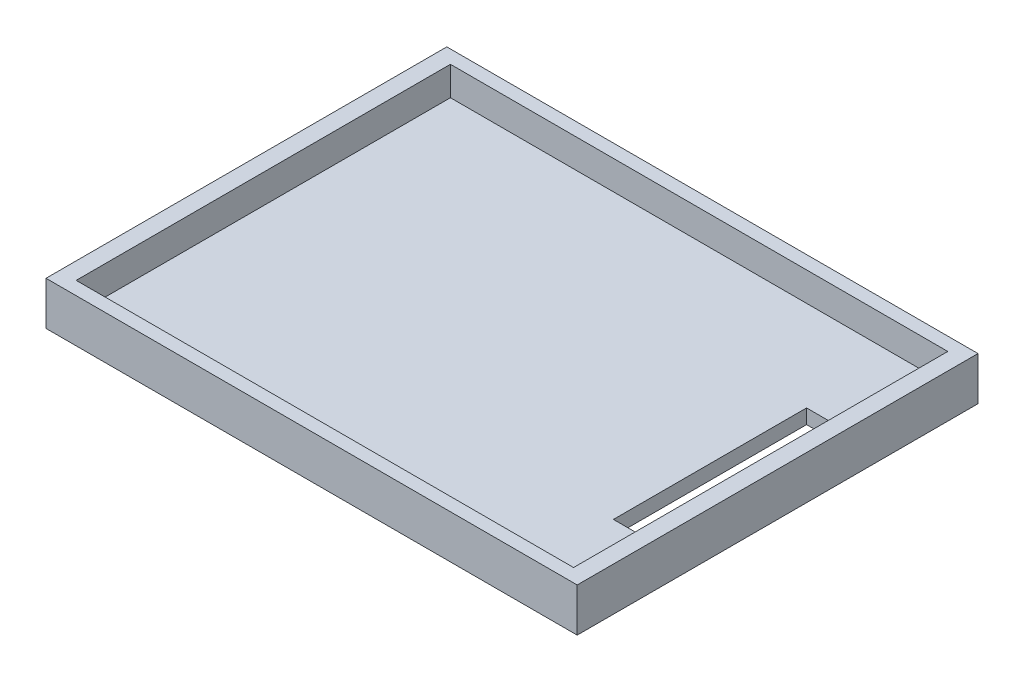
ISO-10303-21;
HEADER;
FILE_DESCRIPTION(('STEP AP214'),'2;1');
FILE_NAME('part.step','',(''),(''),'','','');
FILE_SCHEMA(('AUTOMOTIVE_DESIGN { 1 0 10303 214 1 1 1 1 }'));
ENDSEC;
DATA;
#1=APPLICATION_CONTEXT('core data for automotive mechanical design processes');
#2=APPLICATION_PROTOCOL_DEFINITION('international standard','automotive_design',2000,#1);
#3=PRODUCT_CONTEXT('',#1,'mechanical');
#4=PRODUCT('Part','Part','',(#3));
#5=PRODUCT_RELATED_PRODUCT_CATEGORY('part','',(#4));
#6=PRODUCT_DEFINITION_FORMATION('','',#4);
#7=PRODUCT_DEFINITION_CONTEXT('part definition',#1,'design');
#8=PRODUCT_DEFINITION('design','',#6,#7);
#9=PRODUCT_DEFINITION_SHAPE('','',#8);
#10=(LENGTH_UNIT() NAMED_UNIT(*) SI_UNIT(.MILLI.,.METRE.));
#11=(NAMED_UNIT(*) PLANE_ANGLE_UNIT() SI_UNIT($,.RADIAN.));
#12=(NAMED_UNIT(*) SI_UNIT($,.STERADIAN.) SOLID_ANGLE_UNIT());
#13=UNCERTAINTY_MEASURE_WITH_UNIT(LENGTH_MEASURE(1.E-05),#10,'distance_accuracy_value','');
#14=(GEOMETRIC_REPRESENTATION_CONTEXT(3) GLOBAL_UNCERTAINTY_ASSIGNED_CONTEXT((#13)) GLOBAL_UNIT_ASSIGNED_CONTEXT((#10,
#11,#12)) REPRESENTATION_CONTEXT('',''));
#15=CARTESIAN_POINT('',(0.,0.,0.));
#16=DIRECTION('',(0.,0.,1.));
#17=DIRECTION('',(1.,0.,0.));
#18=AXIS2_PLACEMENT_3D('',#15,#16,#17);
#19=CARTESIAN_POINT('',(51.,8.99999999999999,20.));
#20=DIRECTION('',(-1.,0.,0.));
#21=DIRECTION('',(0.,0.,1.));
#22=AXIS2_PLACEMENT_3D('',#19,#20,#21);
#23=PLANE('',#22);
#24=DIRECTION('',(0.,-1.,0.));
#25=VECTOR('',#24,1.);
#26=CARTESIAN_POINT('',(51.,8.99999999999999,20.));
#27=LINE('',#26,#25);
#28=CARTESIAN_POINT('',(51.,2.99999999999999,20.));
#29=VERTEX_POINT('',#28);
#30=CARTESIAN_POINT('',(51.,0.,20.));
#31=VERTEX_POINT('',#30);
#32=EDGE_CURVE('E190',#29,#31,#27,.T.);
#33=ORIENTED_EDGE('',*,*,#32,.F.);
#34=DIRECTION('',(0.,0.,-1.));
#35=VECTOR('',#34,1.);
#36=CARTESIAN_POINT('',(51.,2.99999999999999,20.));
#37=LINE('',#36,#35);
#38=CARTESIAN_POINT('',(51.,2.99999999999999,-20.));
#39=VERTEX_POINT('',#38);
#40=EDGE_CURVE('E68',#29,#39,#37,.T.);
#41=ORIENTED_EDGE('',*,*,#40,.T.);
#42=DIRECTION('',(0.,-1.,0.));
#43=VECTOR('',#42,1.);
#44=CARTESIAN_POINT('',(51.,8.99999999999999,-20.));
#45=LINE('',#44,#43);
#46=CARTESIAN_POINT('',(51.,0.,-20.));
#47=VERTEX_POINT('',#46);
#48=EDGE_CURVE('E196',#39,#47,#45,.T.);
#49=ORIENTED_EDGE('',*,*,#48,.T.);
#50=DIRECTION('',(0.,0.,-1.));
#51=VECTOR('',#50,1.);
#52=CARTESIAN_POINT('',(51.,0.,20.));
#53=LINE('',#52,#51);
#54=EDGE_CURVE('E178',#31,#47,#53,.T.);
#55=ORIENTED_EDGE('',*,*,#54,.F.);
#56=EDGE_LOOP('',(#33,#41,#49,#55));
#57=FACE_BOUND('',#56,.T.);
#58=ADVANCED_FACE('F45',(#57),#23,.T.);
#59=CARTESIAN_POINT('',(51.,8.99999999999999,-20.));
#60=DIRECTION('',(0.,0.,1.));
#61=DIRECTION('',(1.,0.,0.));
#62=AXIS2_PLACEMENT_3D('',#59,#60,#61);
#63=PLANE('',#62);
#64=ORIENTED_EDGE('',*,*,#48,.F.);
#65=DIRECTION('',(-1.,0.,0.));
#66=VECTOR('',#65,1.);
#67=CARTESIAN_POINT('',(51.,2.99999999999999,-20.));
#68=LINE('',#67,#66);
#69=CARTESIAN_POINT('',(41.,2.99999999999999,-20.));
#70=VERTEX_POINT('',#69);
#71=EDGE_CURVE('E174',#39,#70,#68,.T.);
#72=ORIENTED_EDGE('',*,*,#71,.T.);
#73=DIRECTION('',(0.,-1.,0.));
#74=VECTOR('',#73,1.);
#75=CARTESIAN_POINT('',(41.,8.99999999999999,-20.));
#76=LINE('',#75,#74);
#77=CARTESIAN_POINT('',(41.,0.,-20.));
#78=VERTEX_POINT('',#77);
#79=EDGE_CURVE('E194',#70,#78,#76,.T.);
#80=ORIENTED_EDGE('',*,*,#79,.T.);
#81=DIRECTION('',(-1.,0.,0.));
#82=VECTOR('',#81,1.);
#83=CARTESIAN_POINT('',(51.,0.,-20.));
#84=LINE('',#83,#82);
#85=EDGE_CURVE('E181',#47,#78,#84,.T.);
#86=ORIENTED_EDGE('',*,*,#85,.F.);
#87=EDGE_LOOP('',(#64,#72,#80,#86));
#88=FACE_BOUND('',#87,.T.);
#89=ADVANCED_FACE('F261',(#88),#63,.T.);
#90=CARTESIAN_POINT('',(41.,8.99999999999999,-20.));
#91=DIRECTION('',(1.,0.,0.));
#92=DIRECTION('',(0.,0.,-1.));
#93=AXIS2_PLACEMENT_3D('',#90,#91,#92);
#94=PLANE('',#93);
#95=ORIENTED_EDGE('',*,*,#79,.F.);
#96=DIRECTION('',(0.,0.,1.));
#97=VECTOR('',#96,1.);
#98=CARTESIAN_POINT('',(41.,2.99999999999999,-20.));
#99=LINE('',#98,#97);
#100=CARTESIAN_POINT('',(41.,2.99999999999999,20.));
#101=VERTEX_POINT('',#100);
#102=EDGE_CURVE('E168',#70,#101,#99,.T.);
#103=ORIENTED_EDGE('',*,*,#102,.T.);
#104=DIRECTION('',(0.,-1.,0.));
#105=VECTOR('',#104,1.);
#106=CARTESIAN_POINT('',(41.,8.99999999999999,20.));
#107=LINE('',#106,#105);
#108=CARTESIAN_POINT('',(41.,0.,20.));
#109=VERTEX_POINT('',#108);
#110=EDGE_CURVE('E192',#101,#109,#107,.T.);
#111=ORIENTED_EDGE('',*,*,#110,.T.);
#112=DIRECTION('',(0.,0.,1.));
#113=VECTOR('',#112,1.);
#114=CARTESIAN_POINT('',(41.,0.,-20.));
#115=LINE('',#114,#113);
#116=EDGE_CURVE('E184',#78,#109,#115,.T.);
#117=ORIENTED_EDGE('',*,*,#116,.F.);
#118=EDGE_LOOP('',(#95,#103,#111,#117));
#119=FACE_BOUND('',#118,.T.);
#120=ADVANCED_FACE('F256',(#119),#94,.T.);
#121=CARTESIAN_POINT('',(41.,8.99999999999999,20.));
#122=DIRECTION('',(0.,0.,-1.));
#123=DIRECTION('',(-1.,0.,0.));
#124=AXIS2_PLACEMENT_3D('',#121,#122,#123);
#125=PLANE('',#124);
#126=ORIENTED_EDGE('',*,*,#110,.F.);
#127=DIRECTION('',(1.,0.,0.));
#128=VECTOR('',#127,1.);
#129=CARTESIAN_POINT('',(41.,2.99999999999999,20.));
#130=LINE('',#129,#128);
#131=EDGE_CURVE('E11',#101,#29,#130,.T.);
#132=ORIENTED_EDGE('',*,*,#131,.T.);
#133=ORIENTED_EDGE('',*,*,#32,.T.);
#134=DIRECTION('',(1.,0.,0.));
#135=VECTOR('',#134,1.);
#136=CARTESIAN_POINT('',(41.,0.,20.));
#137=LINE('',#136,#135);
#138=EDGE_CURVE('E187',#109,#31,#137,.T.);
#139=ORIENTED_EDGE('',*,*,#138,.F.);
#140=EDGE_LOOP('',(#126,#132,#133,#139));
#141=FACE_BOUND('',#140,.T.);
#142=ADVANCED_FACE('F248',(#141),#125,.T.);
#143=CARTESIAN_POINT('',(0.,8.99999999999999,0.));
#144=DIRECTION('',(0.,1.,0.));
#145=DIRECTION('',(0.,0.,1.));
#146=AXIS2_PLACEMENT_3D('',#143,#144,#145);
#147=PLANE('',#146);
#148=DIRECTION('',(0.,0.,-1.));
#149=VECTOR('',#148,1.);
#150=CARTESIAN_POINT('',(51.5,8.99999999999999,-38.75));
#151=LINE('',#150,#149);
#152=CARTESIAN_POINT('',(51.5,8.99999999999999,38.75));
#153=VERTEX_POINT('',#152);
#154=CARTESIAN_POINT('',(51.5,8.99999999999999,-38.75));
#155=VERTEX_POINT('',#154);
#156=EDGE_CURVE('E60',#153,#155,#151,.T.);
#157=ORIENTED_EDGE('',*,*,#156,.F.);
#158=DIRECTION('',(1.,0.,0.));
#159=VECTOR('',#158,1.);
#160=CARTESIAN_POINT('',(-51.5,8.99999999999999,38.75));
#161=LINE('',#160,#159);
#162=CARTESIAN_POINT('',(-51.5,8.99999999999999,38.75));
#163=VERTEX_POINT('',#162);
#164=EDGE_CURVE('E153',#163,#153,#161,.T.);
#165=ORIENTED_EDGE('',*,*,#164,.F.);
#166=DIRECTION('',(0.,0.,1.));
#167=VECTOR('',#166,1.);
#168=CARTESIAN_POINT('',(-51.5,8.99999999999999,-38.75));
#169=LINE('',#168,#167);
#170=CARTESIAN_POINT('',(-51.5,8.99999999999999,-38.75));
#171=VERTEX_POINT('',#170);
#172=EDGE_CURVE('E156',#171,#163,#169,.T.);
#173=ORIENTED_EDGE('',*,*,#172,.F.);
#174=DIRECTION('',(-1.,0.,0.));
#175=VECTOR('',#174,1.);
#176=CARTESIAN_POINT('',(-51.5,8.99999999999999,-38.75));
#177=LINE('',#176,#175);
#178=EDGE_CURVE('E162',#155,#171,#177,.T.);
#179=ORIENTED_EDGE('',*,*,#178,.F.);
#180=EDGE_LOOP('',(#157,#165,#173,#179));
#181=FACE_BOUND('',#180,.T.);
#182=DIRECTION('',(0.,0.,1.));
#183=VECTOR('',#182,1.);
#184=CARTESIAN_POINT('',(-55.,8.99999999999999,-41.5));
#185=LINE('',#184,#183);
#186=CARTESIAN_POINT('',(-55.,8.99999999999999,-41.5));
#187=VERTEX_POINT('',#186);
#188=CARTESIAN_POINT('',(-55.,8.99999999999999,41.5));
#189=VERTEX_POINT('',#188);
#190=EDGE_CURVE('E199',#187,#189,#185,.T.);
#191=ORIENTED_EDGE('',*,*,#190,.T.);
#192=DIRECTION('',(1.,0.,0.));
#193=VECTOR('',#192,1.);
#194=CARTESIAN_POINT('',(-55.,8.99999999999999,41.5));
#195=LINE('',#194,#193);
#196=CARTESIAN_POINT('',(55.,8.99999999999999,41.5));
#197=VERTEX_POINT('',#196);
#198=EDGE_CURVE('E202',#189,#197,#195,.T.);
#199=ORIENTED_EDGE('',*,*,#198,.T.);
#200=DIRECTION('',(0.,0.,-1.));
#201=VECTOR('',#200,1.);
#202=CARTESIAN_POINT('',(55.,8.99999999999999,-41.5));
#203=LINE('',#202,#201);
#204=CARTESIAN_POINT('',(55.,8.99999999999999,-41.5));
#205=VERTEX_POINT('',#204);
#206=EDGE_CURVE('E205',#197,#205,#203,.T.);
#207=ORIENTED_EDGE('',*,*,#206,.T.);
#208=DIRECTION('',(-1.,0.,0.));
#209=VECTOR('',#208,1.);
#210=CARTESIAN_POINT('',(-55.,8.99999999999999,-41.5));
#211=LINE('',#210,#209);
#212=EDGE_CURVE('E207',#205,#187,#211,.T.);
#213=ORIENTED_EDGE('',*,*,#212,.T.);
#214=EDGE_LOOP('',(#191,#199,#207,#213));
#215=FACE_BOUND('',#214,.T.);
#216=ADVANCED_FACE('F246',(#181,#215),#147,.T.);
#217=CARTESIAN_POINT('',(0.,0.,0.));
#218=DIRECTION('',(0.,1.,0.));
#219=DIRECTION('',(0.,0.,1.));
#220=AXIS2_PLACEMENT_3D('',#217,#218,#219);
#221=PLANE('',#220);
#222=DIRECTION('',(0.,0.,1.));
#223=VECTOR('',#222,1.);
#224=CARTESIAN_POINT('',(-55.,0.,-41.5));
#225=LINE('',#224,#223);
#226=CARTESIAN_POINT('',(-55.,0.,-41.5));
#227=VERTEX_POINT('',#226);
#228=CARTESIAN_POINT('',(-55.,0.,41.5));
#229=VERTEX_POINT('',#228);
#230=EDGE_CURVE('E198',#227,#229,#225,.T.);
#231=ORIENTED_EDGE('',*,*,#230,.F.);
#232=DIRECTION('',(-1.,0.,0.));
#233=VECTOR('',#232,1.);
#234=CARTESIAN_POINT('',(-55.,0.,-41.5));
#235=LINE('',#234,#233);
#236=CARTESIAN_POINT('',(55.,0.,-41.5));
#237=VERTEX_POINT('',#236);
#238=EDGE_CURVE('E203',#237,#227,#235,.T.);
#239=ORIENTED_EDGE('',*,*,#238,.F.);
#240=DIRECTION('',(0.,0.,-1.));
#241=VECTOR('',#240,1.);
#242=CARTESIAN_POINT('',(55.,0.,-41.5));
#243=LINE('',#242,#241);
#244=CARTESIAN_POINT('',(55.,0.,41.5));
#245=VERTEX_POINT('',#244);
#246=EDGE_CURVE('E214',#245,#237,#243,.T.);
#247=ORIENTED_EDGE('',*,*,#246,.F.);
#248=DIRECTION('',(1.,0.,0.));
#249=VECTOR('',#248,1.);
#250=CARTESIAN_POINT('',(-55.,0.,41.5));
#251=LINE('',#250,#249);
#252=EDGE_CURVE('E212',#229,#245,#251,.T.);
#253=ORIENTED_EDGE('',*,*,#252,.F.);
#254=EDGE_LOOP('',(#231,#239,#247,#253));
#255=FACE_BOUND('',#254,.T.);
#256=ORIENTED_EDGE('',*,*,#54,.T.);
#257=ORIENTED_EDGE('',*,*,#85,.T.);
#258=ORIENTED_EDGE('',*,*,#116,.T.);
#259=ORIENTED_EDGE('',*,*,#138,.T.);
#260=EDGE_LOOP('',(#256,#257,#258,#259));
#261=FACE_BOUND('',#260,.T.);
#262=ADVANCED_FACE('F235',(#255,#261),#221,.F.);
#263=CARTESIAN_POINT('',(-55.,8.99999999999999,-41.5));
#264=DIRECTION('',(1.,0.,0.));
#265=DIRECTION('',(0.,0.,-1.));
#266=AXIS2_PLACEMENT_3D('',#263,#264,#265);
#267=PLANE('',#266);
#268=ORIENTED_EDGE('',*,*,#230,.T.);
#269=DIRECTION('',(0.,-1.,0.));
#270=VECTOR('',#269,1.);
#271=CARTESIAN_POINT('',(-55.,8.99999999999999,41.5));
#272=LINE('',#271,#270);
#273=EDGE_CURVE('E53',#189,#229,#272,.T.);
#274=ORIENTED_EDGE('',*,*,#273,.F.);
#275=ORIENTED_EDGE('',*,*,#190,.F.);
#276=DIRECTION('',(0.,-1.,0.));
#277=VECTOR('',#276,1.);
#278=CARTESIAN_POINT('',(-55.,8.99999999999999,-41.5));
#279=LINE('',#278,#277);
#280=EDGE_CURVE('E209',#187,#227,#279,.T.);
#281=ORIENTED_EDGE('',*,*,#280,.T.);
#282=EDGE_LOOP('',(#268,#274,#275,#281));
#283=FACE_BOUND('',#282,.T.);
#284=ADVANCED_FACE('F47',(#283),#267,.F.);
#285=CARTESIAN_POINT('',(-55.,8.99999999999999,41.5));
#286=DIRECTION('',(0.,0.,-1.));
#287=DIRECTION('',(-1.,0.,0.));
#288=AXIS2_PLACEMENT_3D('',#285,#286,#287);
#289=PLANE('',#288);
#290=ORIENTED_EDGE('',*,*,#252,.T.);
#291=DIRECTION('',(0.,-1.,0.));
#292=VECTOR('',#291,1.);
#293=CARTESIAN_POINT('',(55.,8.99999999999999,41.5));
#294=LINE('',#293,#292);
#295=EDGE_CURVE('E222',#197,#245,#294,.T.);
#296=ORIENTED_EDGE('',*,*,#295,.F.);
#297=ORIENTED_EDGE('',*,*,#198,.F.);
#298=ORIENTED_EDGE('',*,*,#273,.T.);
#299=EDGE_LOOP('',(#290,#296,#297,#298));
#300=FACE_BOUND('',#299,.T.);
#301=ADVANCED_FACE('F227',(#300),#289,.F.);
#302=CARTESIAN_POINT('',(55.,8.99999999999999,-41.5));
#303=DIRECTION('',(-1.,0.,0.));
#304=DIRECTION('',(0.,0.,1.));
#305=AXIS2_PLACEMENT_3D('',#302,#303,#304);
#306=PLANE('',#305);
#307=ORIENTED_EDGE('',*,*,#246,.T.);
#308=DIRECTION('',(0.,-1.,0.));
#309=VECTOR('',#308,1.);
#310=CARTESIAN_POINT('',(55.,8.99999999999999,-41.5));
#311=LINE('',#310,#309);
#312=EDGE_CURVE('E219',#205,#237,#311,.T.);
#313=ORIENTED_EDGE('',*,*,#312,.F.);
#314=ORIENTED_EDGE('',*,*,#206,.F.);
#315=ORIENTED_EDGE('',*,*,#295,.T.);
#316=EDGE_LOOP('',(#307,#313,#314,#315));
#317=FACE_BOUND('',#316,.T.);
#318=ADVANCED_FACE('F240',(#317),#306,.F.);
#319=CARTESIAN_POINT('',(-55.,8.99999999999999,-41.5));
#320=DIRECTION('',(0.,0.,1.));
#321=DIRECTION('',(1.,0.,0.));
#322=AXIS2_PLACEMENT_3D('',#319,#320,#321);
#323=PLANE('',#322);
#324=ORIENTED_EDGE('',*,*,#238,.T.);
#325=ORIENTED_EDGE('',*,*,#280,.F.);
#326=ORIENTED_EDGE('',*,*,#212,.F.);
#327=ORIENTED_EDGE('',*,*,#312,.T.);
#328=EDGE_LOOP('',(#324,#325,#326,#327));
#329=FACE_BOUND('',#328,.T.);
#330=ADVANCED_FACE('F244',(#329),#323,.F.);
#331=CARTESIAN_POINT('',(51.5,2.99999999999999,-38.75));
#332=DIRECTION('',(1.,0.,0.));
#333=DIRECTION('',(0.,0.,-1.));
#334=AXIS2_PLACEMENT_3D('',#331,#332,#333);
#335=PLANE('',#334);
#336=ORIENTED_EDGE('',*,*,#156,.T.);
#337=DIRECTION('',(0.,1.,0.));
#338=VECTOR('',#337,1.);
#339=CARTESIAN_POINT('',(51.5,2.99999999999999,-38.75));
#340=LINE('',#339,#338);
#341=CARTESIAN_POINT('',(51.5,2.99999999999999,-38.75));
#342=VERTEX_POINT('',#341);
#343=EDGE_CURVE('E131',#342,#155,#340,.T.);
#344=ORIENTED_EDGE('',*,*,#343,.F.);
#345=DIRECTION('',(0.,0.,-1.));
#346=VECTOR('',#345,1.);
#347=CARTESIAN_POINT('',(51.5,2.99999999999999,-38.75));
#348=LINE('',#347,#346);
#349=CARTESIAN_POINT('',(51.5,2.99999999999999,38.75));
#350=VERTEX_POINT('',#349);
#351=EDGE_CURVE('E135',#350,#342,#348,.T.);
#352=ORIENTED_EDGE('',*,*,#351,.F.);
#353=DIRECTION('',(0.,1.,0.));
#354=VECTOR('',#353,1.);
#355=CARTESIAN_POINT('',(51.5,2.99999999999999,38.75));
#356=LINE('',#355,#354);
#357=EDGE_CURVE('E166',#350,#153,#356,.T.);
#358=ORIENTED_EDGE('',*,*,#357,.T.);
#359=EDGE_LOOP('',(#336,#344,#352,#358));
#360=FACE_BOUND('',#359,.T.);
#361=ADVANCED_FACE('F133',(#360),#335,.F.);
#362=CARTESIAN_POINT('',(-51.5,2.99999999999999,38.75));
#363=DIRECTION('',(0.,0.,1.));
#364=DIRECTION('',(1.,0.,0.));
#365=AXIS2_PLACEMENT_3D('',#362,#363,#364);
#366=PLANE('',#365);
#367=ORIENTED_EDGE('',*,*,#164,.T.);
#368=ORIENTED_EDGE('',*,*,#357,.F.);
#369=DIRECTION('',(1.,0.,0.));
#370=VECTOR('',#369,1.);
#371=CARTESIAN_POINT('',(-51.5,2.99999999999999,38.75));
#372=LINE('',#371,#370);
#373=CARTESIAN_POINT('',(-51.5,2.99999999999999,38.75));
#374=VERTEX_POINT('',#373);
#375=EDGE_CURVE('E141',#374,#350,#372,.T.);
#376=ORIENTED_EDGE('',*,*,#375,.F.);
#377=DIRECTION('',(0.,1.,0.));
#378=VECTOR('',#377,1.);
#379=CARTESIAN_POINT('',(-51.5,2.99999999999999,38.75));
#380=LINE('',#379,#378);
#381=EDGE_CURVE('E169',#374,#163,#380,.T.);
#382=ORIENTED_EDGE('',*,*,#381,.T.);
#383=EDGE_LOOP('',(#367,#368,#376,#382));
#384=FACE_BOUND('',#383,.T.);
#385=ADVANCED_FACE('F275',(#384),#366,.F.);
#386=CARTESIAN_POINT('',(-51.5,2.99999999999999,-38.75));
#387=DIRECTION('',(-1.,0.,0.));
#388=DIRECTION('',(0.,0.,1.));
#389=AXIS2_PLACEMENT_3D('',#386,#387,#388);
#390=PLANE('',#389);
#391=ORIENTED_EDGE('',*,*,#172,.T.);
#392=ORIENTED_EDGE('',*,*,#381,.F.);
#393=DIRECTION('',(0.,0.,1.));
#394=VECTOR('',#393,1.);
#395=CARTESIAN_POINT('',(-51.5,2.99999999999999,-38.75));
#396=LINE('',#395,#394);
#397=CARTESIAN_POINT('',(-51.5,2.99999999999999,-38.75));
#398=VERTEX_POINT('',#397);
#399=EDGE_CURVE('E149',#398,#374,#396,.T.);
#400=ORIENTED_EDGE('',*,*,#399,.F.);
#401=DIRECTION('',(0.,1.,0.));
#402=VECTOR('',#401,1.);
#403=CARTESIAN_POINT('',(-51.5,2.99999999999999,-38.75));
#404=LINE('',#403,#402);
#405=EDGE_CURVE('E140',#398,#171,#404,.T.);
#406=ORIENTED_EDGE('',*,*,#405,.T.);
#407=EDGE_LOOP('',(#391,#392,#400,#406));
#408=FACE_BOUND('',#407,.T.);
#409=ADVANCED_FACE('F278',(#408),#390,.F.);
#410=CARTESIAN_POINT('',(-51.5,2.99999999999999,-38.75));
#411=DIRECTION('',(0.,0.,-1.));
#412=DIRECTION('',(-1.,0.,0.));
#413=AXIS2_PLACEMENT_3D('',#410,#411,#412);
#414=PLANE('',#413);
#415=ORIENTED_EDGE('',*,*,#178,.T.);
#416=ORIENTED_EDGE('',*,*,#405,.F.);
#417=DIRECTION('',(-1.,0.,0.));
#418=VECTOR('',#417,1.);
#419=CARTESIAN_POINT('',(-51.5,2.99999999999999,-38.75));
#420=LINE('',#419,#418);
#421=EDGE_CURVE('E144',#342,#398,#420,.T.);
#422=ORIENTED_EDGE('',*,*,#421,.F.);
#423=ORIENTED_EDGE('',*,*,#343,.T.);
#424=EDGE_LOOP('',(#415,#416,#422,#423));
#425=FACE_BOUND('',#424,.T.);
#426=ADVANCED_FACE('F145',(#425),#414,.F.);
#427=CARTESIAN_POINT('',(0.,2.99999999999999,0.));
#428=DIRECTION('',(0.,1.,0.));
#429=DIRECTION('',(0.,0.,1.));
#430=AXIS2_PLACEMENT_3D('',#427,#428,#429);
#431=PLANE('',#430);
#432=ORIENTED_EDGE('',*,*,#131,.F.);
#433=ORIENTED_EDGE('',*,*,#102,.F.);
#434=ORIENTED_EDGE('',*,*,#71,.F.);
#435=ORIENTED_EDGE('',*,*,#40,.F.);
#436=EDGE_LOOP('',(#432,#433,#434,#435));
#437=FACE_BOUND('',#436,.T.);
#438=ORIENTED_EDGE('',*,*,#351,.T.);
#439=ORIENTED_EDGE('',*,*,#421,.T.);
#440=ORIENTED_EDGE('',*,*,#399,.T.);
#441=ORIENTED_EDGE('',*,*,#375,.T.);
#442=EDGE_LOOP('',(#438,#439,#440,#441));
#443=FACE_BOUND('',#442,.T.);
#444=ADVANCED_FACE('F151',(#437,#443),#431,.T.);
#445=CLOSED_SHELL('',(#58,#89,#120,#142,#216,#262,#284,#301,#318,#330,#361,#385,#409,#426,#444));
#446=MANIFOLD_SOLID_BREP('B2',#445);
#447=ADVANCED_BREP_SHAPE_REPRESENTATION('',(#18,#446),#14);
#448=SHAPE_DEFINITION_REPRESENTATION(#9,#447);
ENDSEC;
END-ISO-10303-21;
